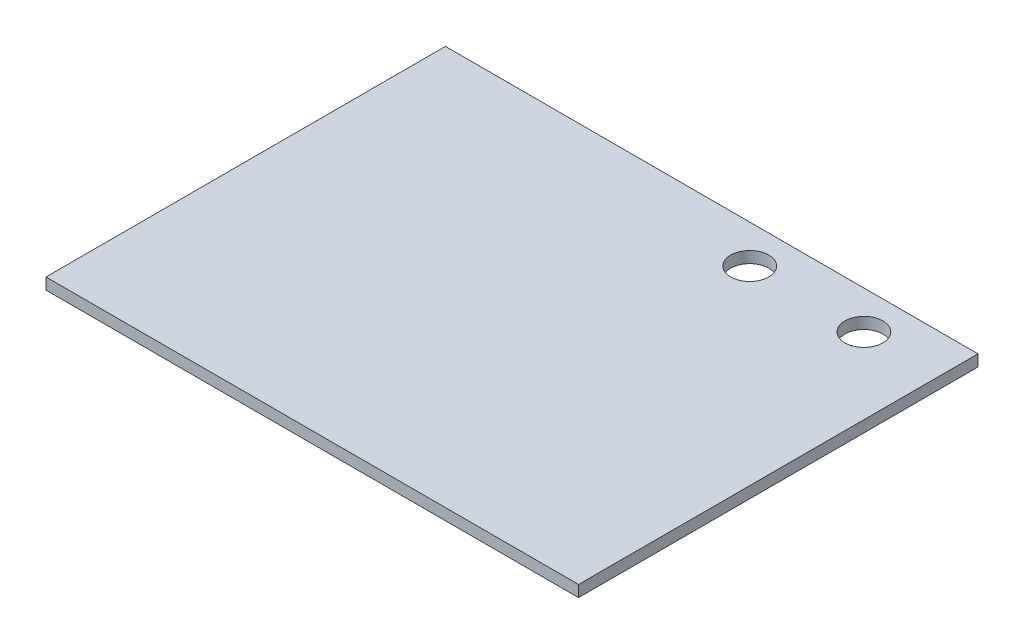
ISO-10303-21;
HEADER;
FILE_DESCRIPTION(('STEP AP214'),'2;1');
FILE_NAME('part.step','',(''),(''),'','','');
FILE_SCHEMA(('AUTOMOTIVE_DESIGN { 1 0 10303 214 1 1 1 1 }'));
ENDSEC;
DATA;
#1=APPLICATION_CONTEXT('core data for automotive mechanical design processes');
#2=APPLICATION_PROTOCOL_DEFINITION('international standard','automotive_design',2000,#1);
#3=PRODUCT_CONTEXT('',#1,'mechanical');
#4=PRODUCT('Part','Part','',(#3));
#5=PRODUCT_RELATED_PRODUCT_CATEGORY('part','',(#4));
#6=PRODUCT_DEFINITION_FORMATION('','',#4);
#7=PRODUCT_DEFINITION_CONTEXT('part definition',#1,'design');
#8=PRODUCT_DEFINITION('design','',#6,#7);
#9=PRODUCT_DEFINITION_SHAPE('','',#8);
#10=(LENGTH_UNIT() NAMED_UNIT(*) SI_UNIT(.MILLI.,.METRE.));
#11=(NAMED_UNIT(*) PLANE_ANGLE_UNIT() SI_UNIT($,.RADIAN.));
#12=(NAMED_UNIT(*) SI_UNIT($,.STERADIAN.) SOLID_ANGLE_UNIT());
#13=UNCERTAINTY_MEASURE_WITH_UNIT(LENGTH_MEASURE(1.E-05),#10,'distance_accuracy_value','');
#14=(GEOMETRIC_REPRESENTATION_CONTEXT(3) GLOBAL_UNCERTAINTY_ASSIGNED_CONTEXT((#13)) GLOBAL_UNIT_ASSIGNED_CONTEXT((#10,
#11,#12)) REPRESENTATION_CONTEXT('',''));
#15=CARTESIAN_POINT('',(0.,0.,0.));
#16=DIRECTION('',(0.,0.,1.));
#17=DIRECTION('',(1.,0.,0.));
#18=AXIS2_PLACEMENT_3D('',#15,#16,#17);
#19=CARTESIAN_POINT('',(-70.,3.,52.5));
#20=DIRECTION('',(1.,0.,0.));
#21=DIRECTION('',(0.,0.,-1.));
#22=AXIS2_PLACEMENT_3D('',#19,#20,#21);
#23=PLANE('',#22);
#24=DIRECTION('',(0.,0.,1.));
#25=VECTOR('',#24,1.);
#26=CARTESIAN_POINT('',(-70.,0.,52.5));
#27=LINE('',#26,#25);
#28=CARTESIAN_POINT('',(-70.,0.,-52.5));
#29=VERTEX_POINT('',#28);
#30=CARTESIAN_POINT('',(-70.,0.,52.5));
#31=VERTEX_POINT('',#30);
#32=EDGE_CURVE('E99',#29,#31,#27,.T.);
#33=ORIENTED_EDGE('',*,*,#32,.T.);
#34=DIRECTION('',(0.,-1.,0.));
#35=VECTOR('',#34,1.);
#36=CARTESIAN_POINT('',(-70.,3.,52.5));
#37=LINE('',#36,#35);
#38=CARTESIAN_POINT('',(-70.,3.,52.5));
#39=VERTEX_POINT('',#38);
#40=EDGE_CURVE('E11',#39,#31,#37,.T.);
#41=ORIENTED_EDGE('',*,*,#40,.F.);
#42=DIRECTION('',(0.,0.,1.));
#43=VECTOR('',#42,1.);
#44=CARTESIAN_POINT('',(-70.,3.,52.5));
#45=LINE('',#44,#43);
#46=CARTESIAN_POINT('',(-70.,3.,-52.5));
#47=VERTEX_POINT('',#46);
#48=EDGE_CURVE('E86',#47,#39,#45,.T.);
#49=ORIENTED_EDGE('',*,*,#48,.F.);
#50=DIRECTION('',(0.,-1.,0.));
#51=VECTOR('',#50,1.);
#52=CARTESIAN_POINT('',(-70.,3.,-52.5));
#53=LINE('',#52,#51);
#54=EDGE_CURVE('E95',#47,#29,#53,.T.);
#55=ORIENTED_EDGE('',*,*,#54,.T.);
#56=EDGE_LOOP('',(#33,#41,#49,#55));
#57=FACE_BOUND('',#56,.T.);
#58=ADVANCED_FACE('F33',(#57),#23,.F.);
#59=CARTESIAN_POINT('',(70.,3.,52.5));
#60=DIRECTION('',(0.,0.,-1.));
#61=DIRECTION('',(-1.,0.,0.));
#62=AXIS2_PLACEMENT_3D('',#59,#60,#61);
#63=PLANE('',#62);
#64=DIRECTION('',(1.,0.,0.));
#65=VECTOR('',#64,1.);
#66=CARTESIAN_POINT('',(70.,0.,52.5));
#67=LINE('',#66,#65);
#68=CARTESIAN_POINT('',(70.,0.,52.5));
#69=VERTEX_POINT('',#68);
#70=EDGE_CURVE('E90',#31,#69,#67,.T.);
#71=ORIENTED_EDGE('',*,*,#70,.T.);
#72=DIRECTION('',(0.,-1.,0.));
#73=VECTOR('',#72,1.);
#74=CARTESIAN_POINT('',(70.,3.,52.5));
#75=LINE('',#74,#73);
#76=CARTESIAN_POINT('',(70.,3.,52.5));
#77=VERTEX_POINT('',#76);
#78=EDGE_CURVE('E42',#77,#69,#75,.T.);
#79=ORIENTED_EDGE('',*,*,#78,.F.);
#80=DIRECTION('',(1.,0.,0.));
#81=VECTOR('',#80,1.);
#82=CARTESIAN_POINT('',(70.,3.,52.5));
#83=LINE('',#82,#81);
#84=EDGE_CURVE('E81',#39,#77,#83,.T.);
#85=ORIENTED_EDGE('',*,*,#84,.F.);
#86=ORIENTED_EDGE('',*,*,#40,.T.);
#87=EDGE_LOOP('',(#71,#79,#85,#86));
#88=FACE_BOUND('',#87,.T.);
#89=ADVANCED_FACE('F89',(#88),#63,.F.);
#90=CARTESIAN_POINT('',(70.,3.,52.5));
#91=DIRECTION('',(-1.,0.,0.));
#92=DIRECTION('',(0.,0.,1.));
#93=AXIS2_PLACEMENT_3D('',#90,#91,#92);
#94=PLANE('',#93);
#95=DIRECTION('',(0.,0.,-1.));
#96=VECTOR('',#95,1.);
#97=CARTESIAN_POINT('',(70.,0.,52.5));
#98=LINE('',#97,#96);
#99=CARTESIAN_POINT('',(70.,0.,-52.5));
#100=VERTEX_POINT('',#99);
#101=EDGE_CURVE('E68',#69,#100,#98,.T.);
#102=ORIENTED_EDGE('',*,*,#101,.T.);
#103=DIRECTION('',(0.,-1.,0.));
#104=VECTOR('',#103,1.);
#105=CARTESIAN_POINT('',(70.,3.,-52.5));
#106=LINE('',#105,#104);
#107=CARTESIAN_POINT('',(70.,3.,-52.5));
#108=VERTEX_POINT('',#107);
#109=EDGE_CURVE('E91',#108,#100,#106,.T.);
#110=ORIENTED_EDGE('',*,*,#109,.F.);
#111=DIRECTION('',(0.,0.,-1.));
#112=VECTOR('',#111,1.);
#113=CARTESIAN_POINT('',(70.,3.,52.5));
#114=LINE('',#113,#112);
#115=EDGE_CURVE('E84',#77,#108,#114,.T.);
#116=ORIENTED_EDGE('',*,*,#115,.F.);
#117=ORIENTED_EDGE('',*,*,#78,.T.);
#118=EDGE_LOOP('',(#102,#110,#116,#117));
#119=FACE_BOUND('',#118,.T.);
#120=ADVANCED_FACE('F93',(#119),#94,.F.);
#121=CARTESIAN_POINT('',(70.,3.,-52.5));
#122=DIRECTION('',(0.,0.,1.));
#123=DIRECTION('',(1.,0.,0.));
#124=AXIS2_PLACEMENT_3D('',#121,#122,#123);
#125=PLANE('',#124);
#126=DIRECTION('',(-1.,0.,0.));
#127=VECTOR('',#126,1.);
#128=CARTESIAN_POINT('',(70.,0.,-52.5));
#129=LINE('',#128,#127);
#130=EDGE_CURVE('E74',#100,#29,#129,.T.);
#131=ORIENTED_EDGE('',*,*,#130,.T.);
#132=ORIENTED_EDGE('',*,*,#54,.F.);
#133=DIRECTION('',(-1.,0.,0.));
#134=VECTOR('',#133,1.);
#135=CARTESIAN_POINT('',(70.,3.,-52.5));
#136=LINE('',#135,#134);
#137=EDGE_CURVE('E51',#108,#47,#136,.T.);
#138=ORIENTED_EDGE('',*,*,#137,.F.);
#139=ORIENTED_EDGE('',*,*,#109,.T.);
#140=EDGE_LOOP('',(#131,#132,#138,#139));
#141=FACE_BOUND('',#140,.T.);
#142=ADVANCED_FACE('F127',(#141),#125,.F.);
#143=CARTESIAN_POINT('',(0.,3.,0.));
#144=DIRECTION('',(0.,1.,0.));
#145=DIRECTION('',(0.,0.,1.));
#146=AXIS2_PLACEMENT_3D('',#143,#144,#145);
#147=PLANE('',#146);
#148=CARTESIAN_POINT('',(20.,3.,-42.5));
#149=DIRECTION('',(0.,1.,0.));
#150=DIRECTION('',(0.,0.,1.));
#151=AXIS2_PLACEMENT_3D('',#148,#149,#150);
#152=CIRCLE('',#151,5.);
#153=CARTESIAN_POINT('',(20.,3.,-37.5));
#154=VERTEX_POINT('',#153);
#155=EDGE_CURVE('E116',#154,#154,#152,.T.);
#156=ORIENTED_EDGE('',*,*,#155,.F.);
#157=EDGE_LOOP('',(#156));
#158=FACE_BOUND('',#157,.T.);
#159=CARTESIAN_POINT('',(50.,3.,-42.5));
#160=DIRECTION('',(0.,1.,0.));
#161=DIRECTION('',(0.,0.,1.));
#162=AXIS2_PLACEMENT_3D('',#159,#160,#161);
#163=CIRCLE('',#162,5.);
#164=CARTESIAN_POINT('',(50.,3.,-37.5));
#165=VERTEX_POINT('',#164);
#166=EDGE_CURVE('E108',#165,#165,#163,.T.);
#167=ORIENTED_EDGE('',*,*,#166,.F.);
#168=EDGE_LOOP('',(#167));
#169=FACE_BOUND('',#168,.T.);
#170=ORIENTED_EDGE('',*,*,#48,.T.);
#171=ORIENTED_EDGE('',*,*,#84,.T.);
#172=ORIENTED_EDGE('',*,*,#115,.T.);
#173=ORIENTED_EDGE('',*,*,#137,.T.);
#174=EDGE_LOOP('',(#170,#171,#172,#173));
#175=FACE_BOUND('',#174,.T.);
#176=ADVANCED_FACE('F82',(#158,#169,#175),#147,.T.);
#177=CARTESIAN_POINT('',(0.,0.,0.));
#178=DIRECTION('',(0.,1.,0.));
#179=DIRECTION('',(0.,0.,1.));
#180=AXIS2_PLACEMENT_3D('',#177,#178,#179);
#181=PLANE('',#180);
#182=CARTESIAN_POINT('',(20.,0.,-42.5));
#183=DIRECTION('',(0.,1.,0.));
#184=DIRECTION('',(0.,0.,1.));
#185=AXIS2_PLACEMENT_3D('',#182,#183,#184);
#186=CIRCLE('',#185,5.);
#187=CARTESIAN_POINT('',(20.,0.,-37.5));
#188=VERTEX_POINT('',#187);
#189=EDGE_CURVE('E36',#188,#188,#186,.T.);
#190=ORIENTED_EDGE('',*,*,#189,.T.);
#191=EDGE_LOOP('',(#190));
#192=FACE_BOUND('',#191,.T.);
#193=CARTESIAN_POINT('',(50.,0.,-42.5));
#194=DIRECTION('',(0.,1.,0.));
#195=DIRECTION('',(0.,0.,1.));
#196=AXIS2_PLACEMENT_3D('',#193,#194,#195);
#197=CIRCLE('',#196,5.);
#198=CARTESIAN_POINT('',(50.,0.,-37.5));
#199=VERTEX_POINT('',#198);
#200=EDGE_CURVE('E102',#199,#199,#197,.T.);
#201=ORIENTED_EDGE('',*,*,#200,.T.);
#202=EDGE_LOOP('',(#201));
#203=FACE_BOUND('',#202,.T.);
#204=ORIENTED_EDGE('',*,*,#32,.F.);
#205=ORIENTED_EDGE('',*,*,#130,.F.);
#206=ORIENTED_EDGE('',*,*,#101,.F.);
#207=ORIENTED_EDGE('',*,*,#70,.F.);
#208=EDGE_LOOP('',(#204,#205,#206,#207));
#209=FACE_BOUND('',#208,.T.);
#210=ADVANCED_FACE('F126',(#192,#203,#209),#181,.F.);
#211=CARTESIAN_POINT('',(50.,-7.,-42.5));
#212=DIRECTION('',(0.,1.,0.));
#213=DIRECTION('',(0.,0.,1.));
#214=AXIS2_PLACEMENT_3D('',#211,#212,#213);
#215=CYLINDRICAL_SURFACE('',#214,5.);
#216=ORIENTED_EDGE('',*,*,#166,.T.);
#217=EDGE_LOOP('',(#216));
#218=FACE_BOUND('',#217,.T.);
#219=ORIENTED_EDGE('',*,*,#200,.F.);
#220=EDGE_LOOP('',(#219));
#221=FACE_BOUND('',#220,.T.);
#222=ADVANCED_FACE('F133',(#218,#221),#215,.F.);
#223=CARTESIAN_POINT('',(20.,-7.,-42.5));
#224=DIRECTION('',(0.,1.,0.));
#225=DIRECTION('',(0.,0.,1.));
#226=AXIS2_PLACEMENT_3D('',#223,#224,#225);
#227=CYLINDRICAL_SURFACE('',#226,5.);
#228=ORIENTED_EDGE('',*,*,#155,.T.);
#229=EDGE_LOOP('',(#228));
#230=FACE_BOUND('',#229,.T.);
#231=ORIENTED_EDGE('',*,*,#189,.F.);
#232=EDGE_LOOP('',(#231));
#233=FACE_BOUND('',#232,.T.);
#234=ADVANCED_FACE('F121',(#230,#233),#227,.F.);
#235=CLOSED_SHELL('',(#58,#89,#120,#142,#176,#210,#222,#234));
#236=MANIFOLD_SOLID_BREP('B2',#235);
#237=ADVANCED_BREP_SHAPE_REPRESENTATION('',(#18,#236),#14);
#238=SHAPE_DEFINITION_REPRESENTATION(#9,#237);
ENDSEC;
END-ISO-10303-21;
